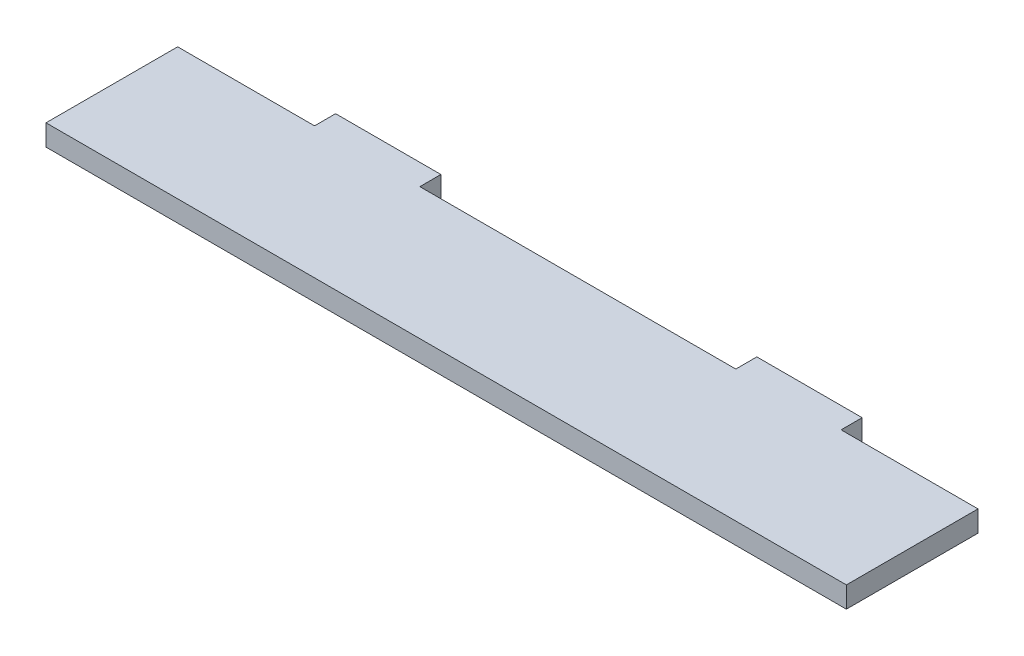
ISO-10303-21;
HEADER;
FILE_DESCRIPTION(('STEP AP214'),'2;1');
FILE_NAME('part.step','',(''),(''),'','','');
FILE_SCHEMA(('AUTOMOTIVE_DESIGN { 1 0 10303 214 1 1 1 1 }'));
ENDSEC;
DATA;
#1=APPLICATION_CONTEXT('core data for automotive mechanical design processes');
#2=APPLICATION_PROTOCOL_DEFINITION('international standard','automotive_design',2000,#1);
#3=PRODUCT_CONTEXT('',#1,'mechanical');
#4=PRODUCT('Part','Part','',(#3));
#5=PRODUCT_RELATED_PRODUCT_CATEGORY('part','',(#4));
#6=PRODUCT_DEFINITION_FORMATION('','',#4);
#7=PRODUCT_DEFINITION_CONTEXT('part definition',#1,'design');
#8=PRODUCT_DEFINITION('design','',#6,#7);
#9=PRODUCT_DEFINITION_SHAPE('','',#8);
#10=(LENGTH_UNIT() NAMED_UNIT(*) SI_UNIT(.MILLI.,.METRE.));
#11=(NAMED_UNIT(*) PLANE_ANGLE_UNIT() SI_UNIT($,.RADIAN.));
#12=(NAMED_UNIT(*) SI_UNIT($,.STERADIAN.) SOLID_ANGLE_UNIT());
#13=UNCERTAINTY_MEASURE_WITH_UNIT(LENGTH_MEASURE(1.E-05),#10,'distance_accuracy_value','');
#14=(GEOMETRIC_REPRESENTATION_CONTEXT(3) GLOBAL_UNCERTAINTY_ASSIGNED_CONTEXT((#13)) GLOBAL_UNIT_ASSIGNED_CONTEXT((#10,
#11,#12)) REPRESENTATION_CONTEXT('',''));
#15=CARTESIAN_POINT('',(0.,0.,0.));
#16=DIRECTION('',(0.,0.,1.));
#17=DIRECTION('',(1.,0.,0.));
#18=AXIS2_PLACEMENT_3D('',#15,#16,#17);
#19=CARTESIAN_POINT('',(0.,0.,0.));
#20=DIRECTION('',(0.,0.,1.));
#21=DIRECTION('',(1.,0.,0.));
#22=AXIS2_PLACEMENT_3D('',#19,#20,#21);
#23=PLANE('',#22);
#24=DIRECTION('',(0.,1.,0.));
#25=VECTOR('',#24,1.);
#26=CARTESIAN_POINT('',(38.1000000000001,101.6,0.));
#27=LINE('',#26,#25);
#28=CARTESIAN_POINT('',(38.1000000000001,101.6,0.));
#29=VERTEX_POINT('',#28);
#30=CARTESIAN_POINT('',(38.1000000000001,106.68,0.));
#31=VERTEX_POINT('',#30);
#32=EDGE_CURVE('E56',#29,#31,#27,.T.);
#33=ORIENTED_EDGE('',*,*,#32,.F.);
#34=DIRECTION('',(1.,0.,0.));
#35=VECTOR('',#34,1.);
#36=CARTESIAN_POINT('',(-96.52,101.6,0.));
#37=LINE('',#36,#35);
#38=CARTESIAN_POINT('',(-38.1,101.6,0.));
#39=VERTEX_POINT('',#38);
#40=EDGE_CURVE('E199',#39,#29,#37,.T.);
#41=ORIENTED_EDGE('',*,*,#40,.F.);
#42=DIRECTION('',(0.,-1.,0.));
#43=VECTOR('',#42,1.);
#44=CARTESIAN_POINT('',(-38.1,101.6,0.));
#45=LINE('',#44,#43);
#46=CARTESIAN_POINT('',(-38.1,106.68,0.));
#47=VERTEX_POINT('',#46);
#48=EDGE_CURVE('E150',#47,#39,#45,.T.);
#49=ORIENTED_EDGE('',*,*,#48,.F.);
#50=DIRECTION('',(1.,0.,0.));
#51=VECTOR('',#50,1.);
#52=CARTESIAN_POINT('',(-96.52,106.68,0.));
#53=LINE('',#52,#51);
#54=EDGE_CURVE('E203',#47,#31,#53,.T.);
#55=ORIENTED_EDGE('',*,*,#54,.T.);
#56=EDGE_LOOP('',(#33,#41,#49,#55));
#57=FACE_BOUND('',#56,.T.);
#58=ADVANCED_FACE('F33',(#57),#23,.F.);
#59=DIRECTION('',(0.,-1.,0.));
#60=VECTOR('',#59,1.);
#61=CARTESIAN_POINT('',(63.5000000000001,101.6,0.));
#62=LINE('',#61,#60);
#63=CARTESIAN_POINT('',(63.5000000000001,106.68,0.));
#64=VERTEX_POINT('',#63);
#65=CARTESIAN_POINT('',(63.5000000000001,101.6,0.));
#66=VERTEX_POINT('',#65);
#67=EDGE_CURVE('E144',#64,#66,#62,.T.);
#68=ORIENTED_EDGE('',*,*,#67,.F.);
#69=CARTESIAN_POINT('',(96.5200000000001,106.68,0.));
#70=VERTEX_POINT('',#69);
#71=EDGE_CURVE('E201',#64,#70,#53,.T.);
#72=ORIENTED_EDGE('',*,*,#71,.T.);
#73=DIRECTION('',(0.,-1.,0.));
#74=VECTOR('',#73,1.);
#75=CARTESIAN_POINT('',(96.5200000000001,106.68,0.));
#76=LINE('',#75,#74);
#77=CARTESIAN_POINT('',(96.5200000000001,101.6,0.));
#78=VERTEX_POINT('',#77);
#79=EDGE_CURVE('E198',#70,#78,#76,.T.);
#80=ORIENTED_EDGE('',*,*,#79,.T.);
#81=EDGE_CURVE('E48',#66,#78,#37,.T.);
#82=ORIENTED_EDGE('',*,*,#81,.F.);
#83=EDGE_LOOP('',(#68,#72,#80,#82));
#84=FACE_BOUND('',#83,.T.);
#85=ADVANCED_FACE('F214',(#84),#23,.F.);
#86=DIRECTION('',(0.,1.,0.));
#87=VECTOR('',#86,1.);
#88=CARTESIAN_POINT('',(-63.5,101.6,0.));
#89=LINE('',#88,#87);
#90=CARTESIAN_POINT('',(-63.5,101.6,0.));
#91=VERTEX_POINT('',#90);
#92=CARTESIAN_POINT('',(-63.5,106.68,0.));
#93=VERTEX_POINT('',#92);
#94=EDGE_CURVE('E147',#91,#93,#89,.T.);
#95=ORIENTED_EDGE('',*,*,#94,.F.);
#96=CARTESIAN_POINT('',(-96.52,101.6,0.));
#97=VERTEX_POINT('',#96);
#98=EDGE_CURVE('E195',#97,#91,#37,.T.);
#99=ORIENTED_EDGE('',*,*,#98,.F.);
#100=DIRECTION('',(0.,-1.,0.));
#101=VECTOR('',#100,1.);
#102=CARTESIAN_POINT('',(-96.52,106.68,0.));
#103=LINE('',#102,#101);
#104=CARTESIAN_POINT('',(-96.52,106.68,0.));
#105=VERTEX_POINT('',#104);
#106=EDGE_CURVE('E179',#105,#97,#103,.T.);
#107=ORIENTED_EDGE('',*,*,#106,.F.);
#108=EDGE_CURVE('E184',#105,#93,#53,.T.);
#109=ORIENTED_EDGE('',*,*,#108,.T.);
#110=EDGE_LOOP('',(#95,#99,#107,#109));
#111=FACE_BOUND('',#110,.T.);
#112=ADVANCED_FACE('F225',(#111),#23,.F.);
#113=CARTESIAN_POINT('',(-96.52,106.68,31.75));
#114=DIRECTION('',(1.,0.,0.));
#115=DIRECTION('',(0.,0.,-1.));
#116=AXIS2_PLACEMENT_3D('',#113,#114,#115);
#117=PLANE('',#116);
#118=ORIENTED_EDGE('',*,*,#106,.T.);
#119=DIRECTION('',(0.,0.,-1.));
#120=VECTOR('',#119,1.);
#121=CARTESIAN_POINT('',(-96.52,101.6,31.75));
#122=LINE('',#121,#120);
#123=CARTESIAN_POINT('',(-96.52,101.6,31.75));
#124=VERTEX_POINT('',#123);
#125=EDGE_CURVE('E11',#124,#97,#122,.T.);
#126=ORIENTED_EDGE('',*,*,#125,.F.);
#127=DIRECTION('',(0.,-1.,0.));
#128=VECTOR('',#127,1.);
#129=CARTESIAN_POINT('',(-96.52,106.68,31.75));
#130=LINE('',#129,#128);
#131=CARTESIAN_POINT('',(-96.52,106.68,31.75));
#132=VERTEX_POINT('',#131);
#133=EDGE_CURVE('E180',#132,#124,#130,.T.);
#134=ORIENTED_EDGE('',*,*,#133,.F.);
#135=DIRECTION('',(0.,0.,-1.));
#136=VECTOR('',#135,1.);
#137=CARTESIAN_POINT('',(-96.52,106.68,31.75));
#138=LINE('',#137,#136);
#139=EDGE_CURVE('E192',#132,#105,#138,.T.);
#140=ORIENTED_EDGE('',*,*,#139,.T.);
#141=EDGE_LOOP('',(#118,#126,#134,#140));
#142=FACE_BOUND('',#141,.T.);
#143=ADVANCED_FACE('F35',(#142),#117,.F.);
#144=CARTESIAN_POINT('',(-96.52,101.6,31.75));
#145=DIRECTION('',(0.,1.,0.));
#146=DIRECTION('',(0.,0.,1.));
#147=AXIS2_PLACEMENT_3D('',#144,#145,#146);
#148=PLANE('',#147);
#149=ORIENTED_EDGE('',*,*,#98,.T.);
#150=DIRECTION('',(0.,0.,1.));
#151=VECTOR('',#150,1.);
#152=CARTESIAN_POINT('',(-63.5,101.6,-5.08));
#153=LINE('',#152,#151);
#154=CARTESIAN_POINT('',(-63.5,101.6,-5.08));
#155=VERTEX_POINT('',#154);
#156=EDGE_CURVE('E164',#155,#91,#153,.T.);
#157=ORIENTED_EDGE('',*,*,#156,.F.);
#158=DIRECTION('',(-1.,0.,0.));
#159=VECTOR('',#158,1.);
#160=CARTESIAN_POINT('',(-63.5,101.6,-5.08));
#161=LINE('',#160,#159);
#162=CARTESIAN_POINT('',(-38.1,101.6,-5.08));
#163=VERTEX_POINT('',#162);
#164=EDGE_CURVE('E163',#163,#155,#161,.T.);
#165=ORIENTED_EDGE('',*,*,#164,.F.);
#166=DIRECTION('',(0.,0.,1.));
#167=VECTOR('',#166,1.);
#168=CARTESIAN_POINT('',(-38.1,101.6,-5.08));
#169=LINE('',#168,#167);
#170=EDGE_CURVE('E170',#163,#39,#169,.T.);
#171=ORIENTED_EDGE('',*,*,#170,.T.);
#172=ORIENTED_EDGE('',*,*,#40,.T.);
#173=DIRECTION('',(0.,0.,1.));
#174=VECTOR('',#173,1.);
#175=CARTESIAN_POINT('',(38.1000000000001,101.6,-5.08));
#176=LINE('',#175,#174);
#177=CARTESIAN_POINT('',(38.1000000000001,101.6,-5.08));
#178=VERTEX_POINT('',#177);
#179=EDGE_CURVE('E241',#178,#29,#176,.T.);
#180=ORIENTED_EDGE('',*,*,#179,.F.);
#181=DIRECTION('',(-1.,0.,0.));
#182=VECTOR('',#181,1.);
#183=CARTESIAN_POINT('',(38.1000000000001,101.6,-5.08));
#184=LINE('',#183,#182);
#185=CARTESIAN_POINT('',(63.5000000000001,101.6,-5.08));
#186=VERTEX_POINT('',#185);
#187=EDGE_CURVE('E140',#186,#178,#184,.T.);
#188=ORIENTED_EDGE('',*,*,#187,.F.);
#189=DIRECTION('',(0.,0.,1.));
#190=VECTOR('',#189,1.);
#191=CARTESIAN_POINT('',(63.5000000000001,101.6,-5.08));
#192=LINE('',#191,#190);
#193=EDGE_CURVE('E152',#186,#66,#192,.T.);
#194=ORIENTED_EDGE('',*,*,#193,.T.);
#195=ORIENTED_EDGE('',*,*,#81,.T.);
#196=DIRECTION('',(0.,0.,-1.));
#197=VECTOR('',#196,1.);
#198=CARTESIAN_POINT('',(96.5200000000001,101.6,31.75));
#199=LINE('',#198,#197);
#200=CARTESIAN_POINT('',(96.5200000000001,101.6,31.75));
#201=VERTEX_POINT('',#200);
#202=EDGE_CURVE('E41',#201,#78,#199,.T.);
#203=ORIENTED_EDGE('',*,*,#202,.F.);
#204=DIRECTION('',(1.,0.,0.));
#205=VECTOR('',#204,1.);
#206=CARTESIAN_POINT('',(-96.52,101.6,31.75));
#207=LINE('',#206,#205);
#208=EDGE_CURVE('E183',#124,#201,#207,.T.);
#209=ORIENTED_EDGE('',*,*,#208,.F.);
#210=ORIENTED_EDGE('',*,*,#125,.T.);
#211=EDGE_LOOP('',(#149,#157,#165,#171,#172,#180,#188,#194,#195,#203,#209,#210));
#212=FACE_BOUND('',#211,.T.);
#213=ADVANCED_FACE('F220',(#212),#148,.F.);
#214=CARTESIAN_POINT('',(96.5200000000001,106.68,31.75));
#215=DIRECTION('',(1.,0.,0.));
#216=DIRECTION('',(0.,0.,-1.));
#217=AXIS2_PLACEMENT_3D('',#214,#215,#216);
#218=PLANE('',#217);
#219=ORIENTED_EDGE('',*,*,#79,.F.);
#220=DIRECTION('',(0.,0.,-1.));
#221=VECTOR('',#220,1.);
#222=CARTESIAN_POINT('',(96.5200000000001,106.68,31.75));
#223=LINE('',#222,#221);
#224=CARTESIAN_POINT('',(96.5200000000001,106.68,31.75));
#225=VERTEX_POINT('',#224);
#226=EDGE_CURVE('E205',#225,#70,#223,.T.);
#227=ORIENTED_EDGE('',*,*,#226,.F.);
#228=DIRECTION('',(0.,-1.,0.));
#229=VECTOR('',#228,1.);
#230=CARTESIAN_POINT('',(96.5200000000001,106.68,31.75));
#231=LINE('',#230,#229);
#232=EDGE_CURVE('E186',#225,#201,#231,.T.);
#233=ORIENTED_EDGE('',*,*,#232,.T.);
#234=ORIENTED_EDGE('',*,*,#202,.T.);
#235=EDGE_LOOP('',(#219,#227,#233,#234));
#236=FACE_BOUND('',#235,.T.);
#237=ADVANCED_FACE('F211',(#236),#218,.T.);
#238=CARTESIAN_POINT('',(-96.52,106.68,31.75));
#239=DIRECTION('',(0.,1.,0.));
#240=DIRECTION('',(0.,0.,1.));
#241=AXIS2_PLACEMENT_3D('',#238,#239,#240);
#242=PLANE('',#241);
#243=ORIENTED_EDGE('',*,*,#108,.F.);
#244=ORIENTED_EDGE('',*,*,#139,.F.);
#245=DIRECTION('',(1.,0.,0.));
#246=VECTOR('',#245,1.);
#247=CARTESIAN_POINT('',(-96.52,106.68,31.75));
#248=LINE('',#247,#246);
#249=EDGE_CURVE('E189',#132,#225,#248,.T.);
#250=ORIENTED_EDGE('',*,*,#249,.T.);
#251=ORIENTED_EDGE('',*,*,#226,.T.);
#252=ORIENTED_EDGE('',*,*,#71,.F.);
#253=DIRECTION('',(0.,0.,1.));
#254=VECTOR('',#253,1.);
#255=CARTESIAN_POINT('',(63.5000000000001,106.68,-5.08));
#256=LINE('',#255,#254);
#257=CARTESIAN_POINT('',(63.5000000000001,106.68,-5.08));
#258=VERTEX_POINT('',#257);
#259=EDGE_CURVE('E131',#258,#64,#256,.T.);
#260=ORIENTED_EDGE('',*,*,#259,.F.);
#261=DIRECTION('',(1.,0.,0.));
#262=VECTOR('',#261,1.);
#263=CARTESIAN_POINT('',(38.1000000000001,106.68,-5.08));
#264=LINE('',#263,#262);
#265=CARTESIAN_POINT('',(38.1000000000001,106.68,-5.08));
#266=VERTEX_POINT('',#265);
#267=EDGE_CURVE('E123',#266,#258,#264,.T.);
#268=ORIENTED_EDGE('',*,*,#267,.F.);
#269=DIRECTION('',(0.,0.,1.));
#270=VECTOR('',#269,1.);
#271=CARTESIAN_POINT('',(38.1000000000001,106.68,-5.08));
#272=LINE('',#271,#270);
#273=EDGE_CURVE('E129',#266,#31,#272,.T.);
#274=ORIENTED_EDGE('',*,*,#273,.T.);
#275=ORIENTED_EDGE('',*,*,#54,.F.);
#276=DIRECTION('',(0.,0.,1.));
#277=VECTOR('',#276,1.);
#278=CARTESIAN_POINT('',(-38.1,106.68,-5.08));
#279=LINE('',#278,#277);
#280=CARTESIAN_POINT('',(-38.1,106.68,-5.08));
#281=VERTEX_POINT('',#280);
#282=EDGE_CURVE('E173',#281,#47,#279,.T.);
#283=ORIENTED_EDGE('',*,*,#282,.F.);
#284=DIRECTION('',(1.,0.,0.));
#285=VECTOR('',#284,1.);
#286=CARTESIAN_POINT('',(-63.5,106.68,-5.08));
#287=LINE('',#286,#285);
#288=CARTESIAN_POINT('',(-63.5,106.68,-5.08));
#289=VERTEX_POINT('',#288);
#290=EDGE_CURVE('E159',#289,#281,#287,.T.);
#291=ORIENTED_EDGE('',*,*,#290,.F.);
#292=DIRECTION('',(0.,0.,1.));
#293=VECTOR('',#292,1.);
#294=CARTESIAN_POINT('',(-63.5,106.68,-5.08));
#295=LINE('',#294,#293);
#296=EDGE_CURVE('E176',#289,#93,#295,.T.);
#297=ORIENTED_EDGE('',*,*,#296,.T.);
#298=EDGE_LOOP('',(#243,#244,#250,#251,#252,#260,#268,#274,#275,#283,#291,#297));
#299=FACE_BOUND('',#298,.T.);
#300=ADVANCED_FACE('F126',(#299),#242,.T.);
#301=CARTESIAN_POINT('',(0.,0.,31.75));
#302=DIRECTION('',(0.,0.,1.));
#303=DIRECTION('',(1.,0.,0.));
#304=AXIS2_PLACEMENT_3D('',#301,#302,#303);
#305=PLANE('',#304);
#306=ORIENTED_EDGE('',*,*,#133,.T.);
#307=ORIENTED_EDGE('',*,*,#208,.T.);
#308=ORIENTED_EDGE('',*,*,#232,.F.);
#309=ORIENTED_EDGE('',*,*,#249,.F.);
#310=EDGE_LOOP('',(#306,#307,#308,#309));
#311=FACE_BOUND('',#310,.T.);
#312=ADVANCED_FACE('F217',(#311),#305,.T.);
#313=CARTESIAN_POINT('',(-63.5,101.6,-5.08));
#314=DIRECTION('',(1.,0.,0.));
#315=DIRECTION('',(0.,0.,-1.));
#316=AXIS2_PLACEMENT_3D('',#313,#314,#315);
#317=PLANE('',#316);
#318=ORIENTED_EDGE('',*,*,#94,.T.);
#319=ORIENTED_EDGE('',*,*,#296,.F.);
#320=DIRECTION('',(0.,1.,0.));
#321=VECTOR('',#320,1.);
#322=CARTESIAN_POINT('',(-63.5,101.6,-5.08));
#323=LINE('',#322,#321);
#324=EDGE_CURVE('E156',#155,#289,#323,.T.);
#325=ORIENTED_EDGE('',*,*,#324,.F.);
#326=ORIENTED_EDGE('',*,*,#156,.T.);
#327=EDGE_LOOP('',(#318,#319,#325,#326));
#328=FACE_BOUND('',#327,.T.);
#329=ADVANCED_FACE('F230',(#328),#317,.F.);
#330=CARTESIAN_POINT('',(-38.1,101.6,-5.08));
#331=DIRECTION('',(-1.,0.,0.));
#332=DIRECTION('',(0.,0.,1.));
#333=AXIS2_PLACEMENT_3D('',#330,#331,#332);
#334=PLANE('',#333);
#335=ORIENTED_EDGE('',*,*,#48,.T.);
#336=ORIENTED_EDGE('',*,*,#170,.F.);
#337=DIRECTION('',(0.,-1.,0.));
#338=VECTOR('',#337,1.);
#339=CARTESIAN_POINT('',(-38.1,101.6,-5.08));
#340=LINE('',#339,#338);
#341=EDGE_CURVE('E161',#281,#163,#340,.T.);
#342=ORIENTED_EDGE('',*,*,#341,.F.);
#343=ORIENTED_EDGE('',*,*,#282,.T.);
#344=EDGE_LOOP('',(#335,#336,#342,#343));
#345=FACE_BOUND('',#344,.T.);
#346=ADVANCED_FACE('F237',(#345),#334,.F.);
#347=CARTESIAN_POINT('',(0.,0.,-5.08));
#348=DIRECTION('',(0.,0.,-1.));
#349=DIRECTION('',(-1.,0.,0.));
#350=AXIS2_PLACEMENT_3D('',#347,#348,#349);
#351=PLANE('',#350);
#352=ORIENTED_EDGE('',*,*,#324,.T.);
#353=ORIENTED_EDGE('',*,*,#290,.T.);
#354=ORIENTED_EDGE('',*,*,#341,.T.);
#355=ORIENTED_EDGE('',*,*,#164,.T.);
#356=EDGE_LOOP('',(#352,#353,#354,#355));
#357=FACE_BOUND('',#356,.T.);
#358=ADVANCED_FACE('F234',(#357),#351,.T.);
#359=CARTESIAN_POINT('',(38.1000000000001,101.6,-5.08));
#360=DIRECTION('',(1.,0.,0.));
#361=DIRECTION('',(0.,0.,-1.));
#362=AXIS2_PLACEMENT_3D('',#359,#360,#361);
#363=PLANE('',#362);
#364=ORIENTED_EDGE('',*,*,#32,.T.);
#365=ORIENTED_EDGE('',*,*,#273,.F.);
#366=DIRECTION('',(0.,1.,0.));
#367=VECTOR('',#366,1.);
#368=CARTESIAN_POINT('',(38.1000000000001,101.6,-5.08));
#369=LINE('',#368,#367);
#370=EDGE_CURVE('E135',#178,#266,#369,.T.);
#371=ORIENTED_EDGE('',*,*,#370,.F.);
#372=ORIENTED_EDGE('',*,*,#179,.T.);
#373=EDGE_LOOP('',(#364,#365,#371,#372));
#374=FACE_BOUND('',#373,.T.);
#375=ADVANCED_FACE('F146',(#374),#363,.F.);
#376=CARTESIAN_POINT('',(63.5000000000001,101.6,-5.08));
#377=DIRECTION('',(-1.,0.,0.));
#378=DIRECTION('',(0.,0.,1.));
#379=AXIS2_PLACEMENT_3D('',#376,#377,#378);
#380=PLANE('',#379);
#381=ORIENTED_EDGE('',*,*,#67,.T.);
#382=ORIENTED_EDGE('',*,*,#193,.F.);
#383=DIRECTION('',(0.,-1.,0.));
#384=VECTOR('',#383,1.);
#385=CARTESIAN_POINT('',(63.5000000000001,101.6,-5.08));
#386=LINE('',#385,#384);
#387=EDGE_CURVE('E134',#258,#186,#386,.T.);
#388=ORIENTED_EDGE('',*,*,#387,.F.);
#389=ORIENTED_EDGE('',*,*,#259,.T.);
#390=EDGE_LOOP('',(#381,#382,#388,#389));
#391=FACE_BOUND('',#390,.T.);
#392=ADVANCED_FACE('F247',(#391),#380,.F.);
#393=CARTESIAN_POINT('',(0.,0.,-5.08));
#394=DIRECTION('',(0.,0.,-1.));
#395=DIRECTION('',(-1.,0.,0.));
#396=AXIS2_PLACEMENT_3D('',#393,#394,#395);
#397=PLANE('',#396);
#398=ORIENTED_EDGE('',*,*,#370,.T.);
#399=ORIENTED_EDGE('',*,*,#267,.T.);
#400=ORIENTED_EDGE('',*,*,#387,.T.);
#401=ORIENTED_EDGE('',*,*,#187,.T.);
#402=EDGE_LOOP('',(#398,#399,#400,#401));
#403=FACE_BOUND('',#402,.T.);
#404=ADVANCED_FACE('F138',(#403),#397,.T.);
#405=CLOSED_SHELL('',(#58,#85,#112,#143,#213,#237,#300,#312,#329,#346,#358,#375,#392,#404));
#406=MANIFOLD_SOLID_BREP('B2',#405);
#407=ADVANCED_BREP_SHAPE_REPRESENTATION('',(#18,#406),#14);
#408=SHAPE_DEFINITION_REPRESENTATION(#9,#407);
ENDSEC;
END-ISO-10303-21;
